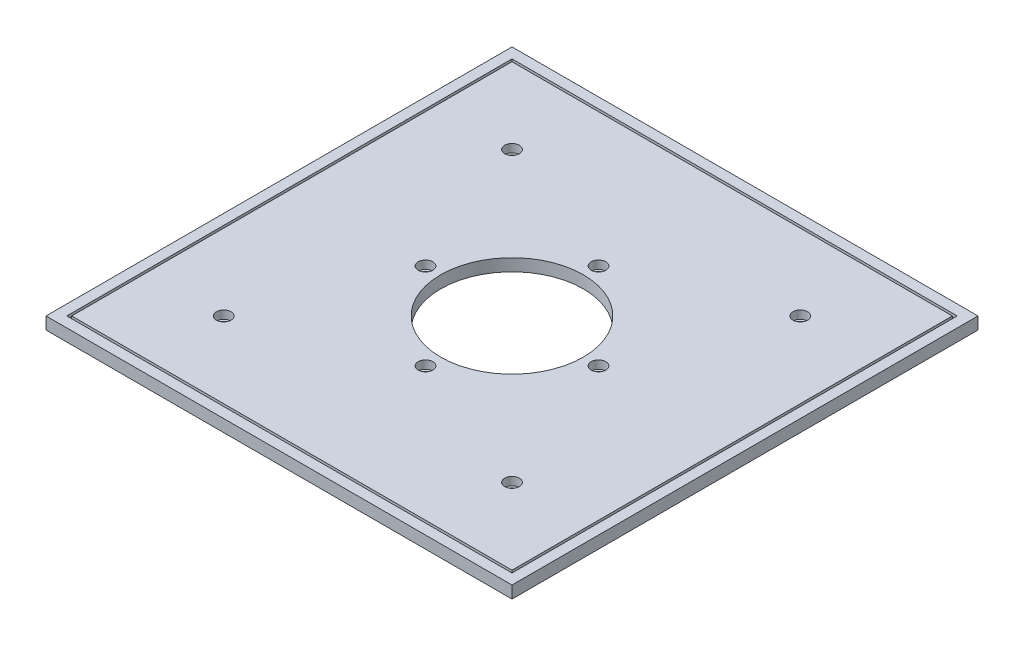
ISO-10303-21;
HEADER;
FILE_DESCRIPTION(('STEP AP214'),'2;1');
FILE_NAME('part.step','',(''),(''),'','','');
FILE_SCHEMA(('AUTOMOTIVE_DESIGN { 1 0 10303 214 1 1 1 1 }'));
ENDSEC;
DATA;
#1=APPLICATION_CONTEXT('core data for automotive mechanical design processes');
#2=APPLICATION_PROTOCOL_DEFINITION('international standard','automotive_design',2000,#1);
#3=PRODUCT_CONTEXT('',#1,'mechanical');
#4=PRODUCT('Part','Part','',(#3));
#5=PRODUCT_RELATED_PRODUCT_CATEGORY('part','',(#4));
#6=PRODUCT_DEFINITION_FORMATION('','',#4);
#7=PRODUCT_DEFINITION_CONTEXT('part definition',#1,'design');
#8=PRODUCT_DEFINITION('design','',#6,#7);
#9=PRODUCT_DEFINITION_SHAPE('','',#8);
#10=(LENGTH_UNIT() NAMED_UNIT(*) SI_UNIT(.MILLI.,.METRE.));
#11=(NAMED_UNIT(*) PLANE_ANGLE_UNIT() SI_UNIT($,.RADIAN.));
#12=(NAMED_UNIT(*) SI_UNIT($,.STERADIAN.) SOLID_ANGLE_UNIT());
#13=UNCERTAINTY_MEASURE_WITH_UNIT(LENGTH_MEASURE(1.E-05),#10,'distance_accuracy_value','');
#14=(GEOMETRIC_REPRESENTATION_CONTEXT(3) GLOBAL_UNCERTAINTY_ASSIGNED_CONTEXT((#13)) GLOBAL_UNIT_ASSIGNED_CONTEXT((#10,
#11,#12)) REPRESENTATION_CONTEXT('',''));
#15=CARTESIAN_POINT('',(0.,0.,0.));
#16=DIRECTION('',(0.,0.,1.));
#17=DIRECTION('',(1.,0.,0.));
#18=AXIS2_PLACEMENT_3D('',#15,#16,#17);
#19=CARTESIAN_POINT('',(0.,15.,0.));
#20=DIRECTION('',(0.,1.,0.));
#21=DIRECTION('',(0.,0.,1.));
#22=AXIS2_PLACEMENT_3D('',#19,#20,#21);
#23=PLANE('',#22);
#24=DIRECTION('',(1.,0.,0.));
#25=VECTOR('',#24,1.);
#26=CARTESIAN_POINT('',(-285.75,15.,285.75));
#27=LINE('',#26,#25);
#28=CARTESIAN_POINT('',(-285.75,15.,285.75));
#29=VERTEX_POINT('',#28);
#30=CARTESIAN_POINT('',(285.75,15.,285.75));
#31=VERTEX_POINT('',#30);
#32=EDGE_CURVE('E300',#29,#31,#27,.T.);
#33=ORIENTED_EDGE('',*,*,#32,.T.);
#34=DIRECTION('',(0.,0.,-1.));
#35=VECTOR('',#34,1.);
#36=CARTESIAN_POINT('',(285.75,15.,285.75));
#37=LINE('',#36,#35);
#38=CARTESIAN_POINT('',(285.75,15.,-285.75));
#39=VERTEX_POINT('',#38);
#40=EDGE_CURVE('E303',#31,#39,#37,.T.);
#41=ORIENTED_EDGE('',*,*,#40,.T.);
#42=DIRECTION('',(-1.,0.,0.));
#43=VECTOR('',#42,1.);
#44=CARTESIAN_POINT('',(-285.75,15.,-285.75));
#45=LINE('',#44,#43);
#46=CARTESIAN_POINT('',(-285.75,15.,-285.75));
#47=VERTEX_POINT('',#46);
#48=EDGE_CURVE('E306',#39,#47,#45,.T.);
#49=ORIENTED_EDGE('',*,*,#48,.T.);
#50=DIRECTION('',(0.,0.,1.));
#51=VECTOR('',#50,1.);
#52=CARTESIAN_POINT('',(-285.75,15.,285.75));
#53=LINE('',#52,#51);
#54=EDGE_CURVE('E308',#47,#29,#53,.T.);
#55=ORIENTED_EDGE('',*,*,#54,.T.);
#56=EDGE_LOOP('',(#33,#41,#49,#55));
#57=FACE_BOUND('',#56,.T.);
#58=DIRECTION('',(1.,0.,0.));
#59=VECTOR('',#58,1.);
#60=CARTESIAN_POINT('',(0.,15.,-273.));
#61=LINE('',#60,#59);
#62=CARTESIAN_POINT('',(-273.,15.,-273.));
#63=VERTEX_POINT('',#62);
#64=CARTESIAN_POINT('',(273.,15.,-273.));
#65=VERTEX_POINT('',#64);
#66=EDGE_CURVE('E169',#63,#65,#61,.T.);
#67=ORIENTED_EDGE('',*,*,#66,.T.);
#68=DIRECTION('',(0.,0.,1.));
#69=VECTOR('',#68,1.);
#70=CARTESIAN_POINT('',(273.,15.,0.));
#71=LINE('',#70,#69);
#72=CARTESIAN_POINT('',(273.,15.,273.));
#73=VERTEX_POINT('',#72);
#74=EDGE_CURVE('E54',#65,#73,#71,.T.);
#75=ORIENTED_EDGE('',*,*,#74,.T.);
#76=DIRECTION('',(1.,0.,0.));
#77=VECTOR('',#76,1.);
#78=CARTESIAN_POINT('',(0.,15.,273.));
#79=LINE('',#78,#77);
#80=CARTESIAN_POINT('',(-273.,15.,273.));
#81=VERTEX_POINT('',#80);
#82=EDGE_CURVE('E174',#81,#73,#79,.T.);
#83=ORIENTED_EDGE('',*,*,#82,.F.);
#84=DIRECTION('',(0.,0.,1.));
#85=VECTOR('',#84,1.);
#86=CARTESIAN_POINT('',(-273.,15.,0.));
#87=LINE('',#86,#85);
#88=EDGE_CURVE('E171',#63,#81,#87,.T.);
#89=ORIENTED_EDGE('',*,*,#88,.F.);
#90=EDGE_LOOP('',(#67,#75,#83,#89));
#91=FACE_BOUND('',#90,.T.);
#92=ADVANCED_FACE('F39',(#57,#91),#23,.T.);
#93=CARTESIAN_POINT('',(-285.75,15.,285.75));
#94=DIRECTION('',(0.,0.,-1.));
#95=DIRECTION('',(-1.,0.,0.));
#96=AXIS2_PLACEMENT_3D('',#93,#94,#95);
#97=PLANE('',#96);
#98=DIRECTION('',(1.,0.,0.));
#99=VECTOR('',#98,1.);
#100=CARTESIAN_POINT('',(-285.75,0.,285.75));
#101=LINE('',#100,#99);
#102=CARTESIAN_POINT('',(-285.75,0.,285.75));
#103=VERTEX_POINT('',#102);
#104=CARTESIAN_POINT('',(285.75,0.,285.75));
#105=VERTEX_POINT('',#104);
#106=EDGE_CURVE('E297',#103,#105,#101,.T.);
#107=ORIENTED_EDGE('',*,*,#106,.T.);
#108=DIRECTION('',(0.,-1.,0.));
#109=VECTOR('',#108,1.);
#110=CARTESIAN_POINT('',(285.75,15.,285.75));
#111=LINE('',#110,#109);
#112=EDGE_CURVE('E11',#31,#105,#111,.T.);
#113=ORIENTED_EDGE('',*,*,#112,.F.);
#114=ORIENTED_EDGE('',*,*,#32,.F.);
#115=DIRECTION('',(0.,-1.,0.));
#116=VECTOR('',#115,1.);
#117=CARTESIAN_POINT('',(-285.75,15.,285.75));
#118=LINE('',#117,#116);
#119=EDGE_CURVE('E310',#29,#103,#118,.T.);
#120=ORIENTED_EDGE('',*,*,#119,.T.);
#121=EDGE_LOOP('',(#107,#113,#114,#120));
#122=FACE_BOUND('',#121,.T.);
#123=ADVANCED_FACE('F41',(#122),#97,.F.);
#124=CARTESIAN_POINT('',(285.75,15.,285.75));
#125=DIRECTION('',(-1.,0.,0.));
#126=DIRECTION('',(0.,0.,1.));
#127=AXIS2_PLACEMENT_3D('',#124,#125,#126);
#128=PLANE('',#127);
#129=DIRECTION('',(0.,0.,-1.));
#130=VECTOR('',#129,1.);
#131=CARTESIAN_POINT('',(285.75,0.,285.75));
#132=LINE('',#131,#130);
#133=CARTESIAN_POINT('',(285.75,0.,-285.75));
#134=VERTEX_POINT('',#133);
#135=EDGE_CURVE('E313',#105,#134,#132,.T.);
#136=ORIENTED_EDGE('',*,*,#135,.T.);
#137=DIRECTION('',(0.,-1.,0.));
#138=VECTOR('',#137,1.);
#139=CARTESIAN_POINT('',(285.75,15.,-285.75));
#140=LINE('',#139,#138);
#141=EDGE_CURVE('E47',#39,#134,#140,.T.);
#142=ORIENTED_EDGE('',*,*,#141,.F.);
#143=ORIENTED_EDGE('',*,*,#40,.F.);
#144=ORIENTED_EDGE('',*,*,#112,.T.);
#145=EDGE_LOOP('',(#136,#142,#143,#144));
#146=FACE_BOUND('',#145,.T.);
#147=ADVANCED_FACE('F343',(#146),#128,.F.);
#148=CARTESIAN_POINT('',(-285.75,15.,-285.75));
#149=DIRECTION('',(0.,0.,1.));
#150=DIRECTION('',(1.,0.,0.));
#151=AXIS2_PLACEMENT_3D('',#148,#149,#150);
#152=PLANE('',#151);
#153=DIRECTION('',(-1.,0.,0.));
#154=VECTOR('',#153,1.);
#155=CARTESIAN_POINT('',(-285.75,0.,-285.75));
#156=LINE('',#155,#154);
#157=CARTESIAN_POINT('',(-285.75,0.,-285.75));
#158=VERTEX_POINT('',#157);
#159=EDGE_CURVE('E315',#134,#158,#156,.T.);
#160=ORIENTED_EDGE('',*,*,#159,.T.);
#161=DIRECTION('',(0.,-1.,0.));
#162=VECTOR('',#161,1.);
#163=CARTESIAN_POINT('',(-285.75,15.,-285.75));
#164=LINE('',#163,#162);
#165=EDGE_CURVE('E320',#47,#158,#164,.T.);
#166=ORIENTED_EDGE('',*,*,#165,.F.);
#167=ORIENTED_EDGE('',*,*,#48,.F.);
#168=ORIENTED_EDGE('',*,*,#141,.T.);
#169=EDGE_LOOP('',(#160,#166,#167,#168));
#170=FACE_BOUND('',#169,.T.);
#171=ADVANCED_FACE('F327',(#170),#152,.F.);
#172=CARTESIAN_POINT('',(-285.75,15.,285.75));
#173=DIRECTION('',(1.,0.,0.));
#174=DIRECTION('',(0.,0.,-1.));
#175=AXIS2_PLACEMENT_3D('',#172,#173,#174);
#176=PLANE('',#175);
#177=DIRECTION('',(0.,0.,1.));
#178=VECTOR('',#177,1.);
#179=CARTESIAN_POINT('',(-285.75,0.,285.75));
#180=LINE('',#179,#178);
#181=EDGE_CURVE('E304',#158,#103,#180,.T.);
#182=ORIENTED_EDGE('',*,*,#181,.T.);
#183=ORIENTED_EDGE('',*,*,#119,.F.);
#184=ORIENTED_EDGE('',*,*,#54,.F.);
#185=ORIENTED_EDGE('',*,*,#165,.T.);
#186=EDGE_LOOP('',(#182,#183,#184,#185));
#187=FACE_BOUND('',#186,.T.);
#188=ADVANCED_FACE('F336',(#187),#176,.F.);
#189=DIRECTION('',(1.,0.,0.));
#190=VECTOR('',#189,1.);
#191=CARTESIAN_POINT('',(0.,15.,-270.));
#192=LINE('',#191,#190);
#193=CARTESIAN_POINT('',(-270.,15.,-270.));
#194=VERTEX_POINT('',#193);
#195=CARTESIAN_POINT('',(270.,15.,-270.));
#196=VERTEX_POINT('',#195);
#197=EDGE_CURVE('E62',#194,#196,#192,.T.);
#198=ORIENTED_EDGE('',*,*,#197,.F.);
#199=DIRECTION('',(0.,0.,1.));
#200=VECTOR('',#199,1.);
#201=CARTESIAN_POINT('',(-270.,15.,0.));
#202=LINE('',#201,#200);
#203=CARTESIAN_POINT('',(-270.,15.,270.));
#204=VERTEX_POINT('',#203);
#205=EDGE_CURVE('E150',#194,#204,#202,.T.);
#206=ORIENTED_EDGE('',*,*,#205,.T.);
#207=DIRECTION('',(1.,0.,0.));
#208=VECTOR('',#207,1.);
#209=CARTESIAN_POINT('',(0.,15.,270.));
#210=LINE('',#209,#208);
#211=CARTESIAN_POINT('',(270.,15.,270.));
#212=VERTEX_POINT('',#211);
#213=EDGE_CURVE('E153',#204,#212,#210,.T.);
#214=ORIENTED_EDGE('',*,*,#213,.T.);
#215=DIRECTION('',(0.,0.,1.));
#216=VECTOR('',#215,1.);
#217=CARTESIAN_POINT('',(270.,15.,0.));
#218=LINE('',#217,#216);
#219=EDGE_CURVE('E178',#196,#212,#218,.T.);
#220=ORIENTED_EDGE('',*,*,#219,.F.);
#221=EDGE_LOOP('',(#198,#206,#214,#220));
#222=FACE_BOUND('',#221,.T.);
#223=CARTESIAN_POINT('',(-106.066017177982,15.,0.));
#224=DIRECTION('',(0.,1.,0.));
#225=DIRECTION('',(0.,0.,1.));
#226=AXIS2_PLACEMENT_3D('',#223,#224,#225);
#227=CIRCLE('',#226,9.00000000000001);
#228=CARTESIAN_POINT('',(-106.066017177982,15.,8.99999999999999));
#229=VERTEX_POINT('',#228);
#230=EDGE_CURVE('E185',#229,#229,#227,.T.);
#231=ORIENTED_EDGE('',*,*,#230,.F.);
#232=EDGE_LOOP('',(#231));
#233=FACE_BOUND('',#232,.T.);
#234=CARTESIAN_POINT('',(0.,15.,-106.066017177982));
#235=DIRECTION('',(0.,1.,0.));
#236=DIRECTION('',(0.,0.,1.));
#237=AXIS2_PLACEMENT_3D('',#234,#235,#236);
#238=CIRCLE('',#237,9.);
#239=CARTESIAN_POINT('',(0.,15.,-97.0660171779821));
#240=VERTEX_POINT('',#239);
#241=EDGE_CURVE('E209',#240,#240,#238,.T.);
#242=ORIENTED_EDGE('',*,*,#241,.F.);
#243=EDGE_LOOP('',(#242));
#244=FACE_BOUND('',#243,.T.);
#245=CARTESIAN_POINT('',(106.066017177982,15.,0.));
#246=DIRECTION('',(0.,1.,0.));
#247=DIRECTION('',(0.,0.,1.));
#248=AXIS2_PLACEMENT_3D('',#245,#246,#247);
#249=CIRCLE('',#248,9.00000000000001);
#250=CARTESIAN_POINT('',(106.066017177982,15.,9.00000000000004));
#251=VERTEX_POINT('',#250);
#252=EDGE_CURVE('E221',#251,#251,#249,.T.);
#253=ORIENTED_EDGE('',*,*,#252,.F.);
#254=EDGE_LOOP('',(#253));
#255=FACE_BOUND('',#254,.T.);
#256=CARTESIAN_POINT('',(0.,15.,106.066017177982));
#257=DIRECTION('',(0.,1.,0.));
#258=DIRECTION('',(0.,0.,1.));
#259=AXIS2_PLACEMENT_3D('',#256,#257,#258);
#260=CIRCLE('',#259,9.);
#261=CARTESIAN_POINT('',(0.,15.,115.066017177982));
#262=VERTEX_POINT('',#261);
#263=EDGE_CURVE('E233',#262,#262,#260,.T.);
#264=ORIENTED_EDGE('',*,*,#263,.F.);
#265=EDGE_LOOP('',(#264));
#266=FACE_BOUND('',#265,.T.);
#267=CARTESIAN_POINT('',(176.776695296637,15.,-176.776695296637));
#268=DIRECTION('',(0.,1.,0.));
#269=DIRECTION('',(0.,0.,1.));
#270=AXIS2_PLACEMENT_3D('',#267,#268,#269);
#271=CIRCLE('',#270,9.00000000000001);
#272=CARTESIAN_POINT('',(176.776695296637,15.,-167.776695296637));
#273=VERTEX_POINT('',#272);
#274=EDGE_CURVE('E245',#273,#273,#271,.T.);
#275=ORIENTED_EDGE('',*,*,#274,.F.);
#276=EDGE_LOOP('',(#275));
#277=FACE_BOUND('',#276,.T.);
#278=CARTESIAN_POINT('',(-176.776695296637,15.,-176.776695296637));
#279=DIRECTION('',(0.,1.,0.));
#280=DIRECTION('',(0.,0.,1.));
#281=AXIS2_PLACEMENT_3D('',#278,#279,#280);
#282=CIRCLE('',#281,9.00000000000001);
#283=CARTESIAN_POINT('',(-176.776695296637,15.,-167.776695296637));
#284=VERTEX_POINT('',#283);
#285=EDGE_CURVE('E257',#284,#284,#282,.T.);
#286=ORIENTED_EDGE('',*,*,#285,.F.);
#287=EDGE_LOOP('',(#286));
#288=FACE_BOUND('',#287,.T.);
#289=CARTESIAN_POINT('',(176.776695296637,15.,176.776695296637));
#290=DIRECTION('',(0.,1.,0.));
#291=DIRECTION('',(0.,0.,1.));
#292=AXIS2_PLACEMENT_3D('',#289,#290,#291);
#293=CIRCLE('',#292,9.00000000000001);
#294=CARTESIAN_POINT('',(176.776695296637,15.,185.776695296637));
#295=VERTEX_POINT('',#294);
#296=EDGE_CURVE('E269',#295,#295,#293,.T.);
#297=ORIENTED_EDGE('',*,*,#296,.F.);
#298=EDGE_LOOP('',(#297));
#299=FACE_BOUND('',#298,.T.);
#300=CARTESIAN_POINT('',(-176.776695296637,15.,176.776695296637));
#301=DIRECTION('',(0.,1.,0.));
#302=DIRECTION('',(0.,0.,1.));
#303=AXIS2_PLACEMENT_3D('',#300,#301,#302);
#304=CIRCLE('',#303,9.00000000000001);
#305=CARTESIAN_POINT('',(-176.776695296637,15.,185.776695296637));
#306=VERTEX_POINT('',#305);
#307=EDGE_CURVE('E281',#306,#306,#304,.T.);
#308=ORIENTED_EDGE('',*,*,#307,.F.);
#309=EDGE_LOOP('',(#308));
#310=FACE_BOUND('',#309,.T.);
#311=CARTESIAN_POINT('',(0.,15.,0.));
#312=DIRECTION('',(0.,1.,0.));
#313=DIRECTION('',(0.,0.,1.));
#314=AXIS2_PLACEMENT_3D('',#311,#312,#313);
#315=CIRCLE('',#314,87.5);
#316=CARTESIAN_POINT('',(0.,15.,87.5));
#317=VERTEX_POINT('',#316);
#318=EDGE_CURVE('E293',#317,#317,#315,.T.);
#319=ORIENTED_EDGE('',*,*,#318,.F.);
#320=EDGE_LOOP('',(#319));
#321=FACE_BOUND('',#320,.T.);
#322=ADVANCED_FACE('F352',(#222,#233,#244,#255,#266,#277,#288,#299,#310,#321),#23,.T.);
#323=CARTESIAN_POINT('',(0.,0.,0.));
#324=DIRECTION('',(0.,1.,0.));
#325=DIRECTION('',(0.,0.,1.));
#326=AXIS2_PLACEMENT_3D('',#323,#324,#325);
#327=PLANE('',#326);
#328=CARTESIAN_POINT('',(-106.066017177982,0.,0.));
#329=DIRECTION('',(0.,1.,0.));
#330=DIRECTION('',(0.,0.,1.));
#331=AXIS2_PLACEMENT_3D('',#328,#329,#330);
#332=CIRCLE('',#331,5.99999999999999);
#333=CARTESIAN_POINT('',(-106.066017177982,0.,5.99999999999998));
#334=VERTEX_POINT('',#333);
#335=EDGE_CURVE('E206',#334,#334,#332,.T.);
#336=ORIENTED_EDGE('',*,*,#335,.T.);
#337=EDGE_LOOP('',(#336));
#338=FACE_BOUND('',#337,.T.);
#339=CARTESIAN_POINT('',(0.,0.,-106.066017177982));
#340=DIRECTION('',(0.,1.,0.));
#341=DIRECTION('',(0.,0.,1.));
#342=AXIS2_PLACEMENT_3D('',#339,#340,#341);
#343=CIRCLE('',#342,6.);
#344=CARTESIAN_POINT('',(0.,0.,-100.066017177982));
#345=VERTEX_POINT('',#344);
#346=EDGE_CURVE('E218',#345,#345,#343,.T.);
#347=ORIENTED_EDGE('',*,*,#346,.T.);
#348=EDGE_LOOP('',(#347));
#349=FACE_BOUND('',#348,.T.);
#350=CARTESIAN_POINT('',(106.066017177982,0.,0.));
#351=DIRECTION('',(0.,1.,0.));
#352=DIRECTION('',(0.,0.,1.));
#353=AXIS2_PLACEMENT_3D('',#350,#351,#352);
#354=CIRCLE('',#353,5.99999999999999);
#355=CARTESIAN_POINT('',(106.066017177982,0.,6.00000000000002));
#356=VERTEX_POINT('',#355);
#357=EDGE_CURVE('E230',#356,#356,#354,.T.);
#358=ORIENTED_EDGE('',*,*,#357,.T.);
#359=EDGE_LOOP('',(#358));
#360=FACE_BOUND('',#359,.T.);
#361=CARTESIAN_POINT('',(0.,0.,106.066017177982));
#362=DIRECTION('',(0.,1.,0.));
#363=DIRECTION('',(0.,0.,1.));
#364=AXIS2_PLACEMENT_3D('',#361,#362,#363);
#365=CIRCLE('',#364,6.);
#366=CARTESIAN_POINT('',(0.,0.,112.066017177982));
#367=VERTEX_POINT('',#366);
#368=EDGE_CURVE('E242',#367,#367,#365,.T.);
#369=ORIENTED_EDGE('',*,*,#368,.T.);
#370=EDGE_LOOP('',(#369));
#371=FACE_BOUND('',#370,.T.);
#372=CARTESIAN_POINT('',(176.776695296637,0.,-176.776695296637));
#373=DIRECTION('',(0.,1.,0.));
#374=DIRECTION('',(0.,0.,1.));
#375=AXIS2_PLACEMENT_3D('',#372,#373,#374);
#376=CIRCLE('',#375,6.00000000000001);
#377=CARTESIAN_POINT('',(176.776695296637,0.,-170.776695296637));
#378=VERTEX_POINT('',#377);
#379=EDGE_CURVE('E254',#378,#378,#376,.T.);
#380=ORIENTED_EDGE('',*,*,#379,.T.);
#381=EDGE_LOOP('',(#380));
#382=FACE_BOUND('',#381,.T.);
#383=CARTESIAN_POINT('',(-176.776695296637,0.,-176.776695296637));
#384=DIRECTION('',(0.,1.,0.));
#385=DIRECTION('',(0.,0.,1.));
#386=AXIS2_PLACEMENT_3D('',#383,#384,#385);
#387=CIRCLE('',#386,6.00000000000001);
#388=CARTESIAN_POINT('',(-176.776695296637,0.,-170.776695296637));
#389=VERTEX_POINT('',#388);
#390=EDGE_CURVE('E266',#389,#389,#387,.T.);
#391=ORIENTED_EDGE('',*,*,#390,.T.);
#392=EDGE_LOOP('',(#391));
#393=FACE_BOUND('',#392,.T.);
#394=CARTESIAN_POINT('',(176.776695296637,0.,176.776695296637));
#395=DIRECTION('',(0.,1.,0.));
#396=DIRECTION('',(0.,0.,1.));
#397=AXIS2_PLACEMENT_3D('',#394,#395,#396);
#398=CIRCLE('',#397,6.00000000000001);
#399=CARTESIAN_POINT('',(176.776695296637,0.,182.776695296637));
#400=VERTEX_POINT('',#399);
#401=EDGE_CURVE('E278',#400,#400,#398,.T.);
#402=ORIENTED_EDGE('',*,*,#401,.T.);
#403=EDGE_LOOP('',(#402));
#404=FACE_BOUND('',#403,.T.);
#405=CARTESIAN_POINT('',(-176.776695296637,0.,176.776695296637));
#406=DIRECTION('',(0.,1.,0.));
#407=DIRECTION('',(0.,0.,1.));
#408=AXIS2_PLACEMENT_3D('',#405,#406,#407);
#409=CIRCLE('',#408,6.00000000000001);
#410=CARTESIAN_POINT('',(-176.776695296637,0.,182.776695296637));
#411=VERTEX_POINT('',#410);
#412=EDGE_CURVE('E290',#411,#411,#409,.T.);
#413=ORIENTED_EDGE('',*,*,#412,.T.);
#414=EDGE_LOOP('',(#413));
#415=FACE_BOUND('',#414,.T.);
#416=CARTESIAN_POINT('',(0.,0.,0.));
#417=DIRECTION('',(0.,1.,0.));
#418=DIRECTION('',(0.,0.,1.));
#419=AXIS2_PLACEMENT_3D('',#416,#417,#418);
#420=CIRCLE('',#419,87.5);
#421=CARTESIAN_POINT('',(0.,0.,87.5));
#422=VERTEX_POINT('',#421);
#423=EDGE_CURVE('E294',#422,#422,#420,.T.);
#424=ORIENTED_EDGE('',*,*,#423,.T.);
#425=EDGE_LOOP('',(#424));
#426=FACE_BOUND('',#425,.T.);
#427=ORIENTED_EDGE('',*,*,#106,.F.);
#428=ORIENTED_EDGE('',*,*,#181,.F.);
#429=ORIENTED_EDGE('',*,*,#159,.F.);
#430=ORIENTED_EDGE('',*,*,#135,.F.);
#431=EDGE_LOOP('',(#427,#428,#429,#430));
#432=FACE_BOUND('',#431,.T.);
#433=ADVANCED_FACE('F333',(#338,#349,#360,#371,#382,#393,#404,#415,#426,#432),#327,.F.);
#434=CARTESIAN_POINT('',(0.,0.,0.));
#435=DIRECTION('',(0.,1.,0.));
#436=DIRECTION('',(0.,0.,1.));
#437=AXIS2_PLACEMENT_3D('',#434,#435,#436);
#438=CYLINDRICAL_SURFACE('',#437,87.5);
#439=ORIENTED_EDGE('',*,*,#423,.F.);
#440=EDGE_LOOP('',(#439));
#441=FACE_BOUND('',#440,.T.);
#442=ORIENTED_EDGE('',*,*,#318,.T.);
#443=EDGE_LOOP('',(#442));
#444=FACE_BOUND('',#443,.T.);
#445=ADVANCED_FACE('F364',(#441,#444),#438,.F.);
#446=CARTESIAN_POINT('',(-176.776695296637,15.,176.776695296637));
#447=DIRECTION('',(0.,1.,0.));
#448=DIRECTION('',(0.,0.,1.));
#449=AXIS2_PLACEMENT_3D('',#446,#447,#448);
#450=CYLINDRICAL_SURFACE('',#449,6.00000000000001);
#451=ORIENTED_EDGE('',*,*,#412,.F.);
#452=EDGE_LOOP('',(#451));
#453=FACE_BOUND('',#452,.T.);
#454=CARTESIAN_POINT('',(-176.776695296637,5.,176.776695296637));
#455=DIRECTION('',(0.,1.,0.));
#456=DIRECTION('',(0.,0.,1.));
#457=AXIS2_PLACEMENT_3D('',#454,#455,#456);
#458=CIRCLE('',#457,6.00000000000001);
#459=CARTESIAN_POINT('',(-176.776695296637,5.,182.776695296637));
#460=VERTEX_POINT('',#459);
#461=EDGE_CURVE('E287',#460,#460,#458,.T.);
#462=ORIENTED_EDGE('',*,*,#461,.T.);
#463=EDGE_LOOP('',(#462));
#464=FACE_BOUND('',#463,.T.);
#465=ADVANCED_FACE('F389',(#453,#464),#450,.F.);
#466=CARTESIAN_POINT('',(-170.776695296637,5.,176.776695296637));
#467=DIRECTION('',(0.,-1.,0.));
#468=DIRECTION('',(0.,0.,-1.));
#469=AXIS2_PLACEMENT_3D('',#466,#467,#468);
#470=PLANE('',#469);
#471=ORIENTED_EDGE('',*,*,#461,.F.);
#472=EDGE_LOOP('',(#471));
#473=FACE_BOUND('',#472,.T.);
#474=CARTESIAN_POINT('',(-176.776695296637,5.,176.776695296637));
#475=DIRECTION('',(0.,1.,0.));
#476=DIRECTION('',(0.,0.,1.));
#477=AXIS2_PLACEMENT_3D('',#474,#475,#476);
#478=CIRCLE('',#477,9.00000000000001);
#479=CARTESIAN_POINT('',(-176.776695296637,5.,185.776695296637));
#480=VERTEX_POINT('',#479);
#481=EDGE_CURVE('E284',#480,#480,#478,.T.);
#482=ORIENTED_EDGE('',*,*,#481,.T.);
#483=EDGE_LOOP('',(#482));
#484=FACE_BOUND('',#483,.T.);
#485=ADVANCED_FACE('F394',(#473,#484),#470,.F.);
#486=CARTESIAN_POINT('',(-176.776695296637,15.,176.776695296637));
#487=DIRECTION('',(0.,1.,0.));
#488=DIRECTION('',(0.,0.,1.));
#489=AXIS2_PLACEMENT_3D('',#486,#487,#488);
#490=CYLINDRICAL_SURFACE('',#489,9.00000000000001);
#491=ORIENTED_EDGE('',*,*,#481,.F.);
#492=EDGE_LOOP('',(#491));
#493=FACE_BOUND('',#492,.T.);
#494=ORIENTED_EDGE('',*,*,#307,.T.);
#495=EDGE_LOOP('',(#494));
#496=FACE_BOUND('',#495,.T.);
#497=ADVANCED_FACE('F401',(#493,#496),#490,.F.);
#498=CARTESIAN_POINT('',(176.776695296637,15.,176.776695296637));
#499=DIRECTION('',(0.,1.,0.));
#500=DIRECTION('',(0.,0.,1.));
#501=AXIS2_PLACEMENT_3D('',#498,#499,#500);
#502=CYLINDRICAL_SURFACE('',#501,6.00000000000001);
#503=ORIENTED_EDGE('',*,*,#401,.F.);
#504=EDGE_LOOP('',(#503));
#505=FACE_BOUND('',#504,.T.);
#506=CARTESIAN_POINT('',(176.776695296637,5.,176.776695296637));
#507=DIRECTION('',(0.,1.,0.));
#508=DIRECTION('',(0.,0.,1.));
#509=AXIS2_PLACEMENT_3D('',#506,#507,#508);
#510=CIRCLE('',#509,6.00000000000001);
#511=CARTESIAN_POINT('',(176.776695296637,5.,182.776695296637));
#512=VERTEX_POINT('',#511);
#513=EDGE_CURVE('E275',#512,#512,#510,.T.);
#514=ORIENTED_EDGE('',*,*,#513,.T.);
#515=EDGE_LOOP('',(#514));
#516=FACE_BOUND('',#515,.T.);
#517=ADVANCED_FACE('F405',(#505,#516),#502,.F.);
#518=CARTESIAN_POINT('',(182.776695296637,5.,176.776695296637));
#519=DIRECTION('',(0.,-1.,0.));
#520=DIRECTION('',(0.,0.,-1.));
#521=AXIS2_PLACEMENT_3D('',#518,#519,#520);
#522=PLANE('',#521);
#523=ORIENTED_EDGE('',*,*,#513,.F.);
#524=EDGE_LOOP('',(#523));
#525=FACE_BOUND('',#524,.T.);
#526=CARTESIAN_POINT('',(176.776695296637,5.,176.776695296637));
#527=DIRECTION('',(0.,1.,0.));
#528=DIRECTION('',(0.,0.,1.));
#529=AXIS2_PLACEMENT_3D('',#526,#527,#528);
#530=CIRCLE('',#529,9.00000000000001);
#531=CARTESIAN_POINT('',(176.776695296637,5.,185.776695296637));
#532=VERTEX_POINT('',#531);
#533=EDGE_CURVE('E272',#532,#532,#530,.T.);
#534=ORIENTED_EDGE('',*,*,#533,.T.);
#535=EDGE_LOOP('',(#534));
#536=FACE_BOUND('',#535,.T.);
#537=ADVANCED_FACE('F409',(#525,#536),#522,.F.);
#538=CARTESIAN_POINT('',(176.776695296637,15.,176.776695296637));
#539=DIRECTION('',(0.,1.,0.));
#540=DIRECTION('',(0.,0.,1.));
#541=AXIS2_PLACEMENT_3D('',#538,#539,#540);
#542=CYLINDRICAL_SURFACE('',#541,9.00000000000001);
#543=ORIENTED_EDGE('',*,*,#533,.F.);
#544=EDGE_LOOP('',(#543));
#545=FACE_BOUND('',#544,.T.);
#546=ORIENTED_EDGE('',*,*,#296,.T.);
#547=EDGE_LOOP('',(#546));
#548=FACE_BOUND('',#547,.T.);
#549=ADVANCED_FACE('F413',(#545,#548),#542,.F.);
#550=CARTESIAN_POINT('',(-176.776695296637,15.,-176.776695296637));
#551=DIRECTION('',(0.,1.,0.));
#552=DIRECTION('',(0.,0.,1.));
#553=AXIS2_PLACEMENT_3D('',#550,#551,#552);
#554=CYLINDRICAL_SURFACE('',#553,6.00000000000001);
#555=ORIENTED_EDGE('',*,*,#390,.F.);
#556=EDGE_LOOP('',(#555));
#557=FACE_BOUND('',#556,.T.);
#558=CARTESIAN_POINT('',(-176.776695296637,5.,-176.776695296637));
#559=DIRECTION('',(0.,1.,0.));
#560=DIRECTION('',(0.,0.,1.));
#561=AXIS2_PLACEMENT_3D('',#558,#559,#560);
#562=CIRCLE('',#561,6.00000000000001);
#563=CARTESIAN_POINT('',(-176.776695296637,5.,-170.776695296637));
#564=VERTEX_POINT('',#563);
#565=EDGE_CURVE('E263',#564,#564,#562,.T.);
#566=ORIENTED_EDGE('',*,*,#565,.T.);
#567=EDGE_LOOP('',(#566));
#568=FACE_BOUND('',#567,.T.);
#569=ADVANCED_FACE('F417',(#557,#568),#554,.F.);
#570=CARTESIAN_POINT('',(-170.776695296637,5.,-176.776695296637));
#571=DIRECTION('',(0.,-1.,0.));
#572=DIRECTION('',(0.,0.,-1.));
#573=AXIS2_PLACEMENT_3D('',#570,#571,#572);
#574=PLANE('',#573);
#575=ORIENTED_EDGE('',*,*,#565,.F.);
#576=EDGE_LOOP('',(#575));
#577=FACE_BOUND('',#576,.T.);
#578=CARTESIAN_POINT('',(-176.776695296637,5.,-176.776695296637));
#579=DIRECTION('',(0.,1.,0.));
#580=DIRECTION('',(0.,0.,1.));
#581=AXIS2_PLACEMENT_3D('',#578,#579,#580);
#582=CIRCLE('',#581,9.00000000000001);
#583=CARTESIAN_POINT('',(-176.776695296637,5.,-167.776695296637));
#584=VERTEX_POINT('',#583);
#585=EDGE_CURVE('E260',#584,#584,#582,.T.);
#586=ORIENTED_EDGE('',*,*,#585,.T.);
#587=EDGE_LOOP('',(#586));
#588=FACE_BOUND('',#587,.T.);
#589=ADVANCED_FACE('F421',(#577,#588),#574,.F.);
#590=CARTESIAN_POINT('',(-176.776695296637,15.,-176.776695296637));
#591=DIRECTION('',(0.,1.,0.));
#592=DIRECTION('',(0.,0.,1.));
#593=AXIS2_PLACEMENT_3D('',#590,#591,#592);
#594=CYLINDRICAL_SURFACE('',#593,9.00000000000001);
#595=ORIENTED_EDGE('',*,*,#585,.F.);
#596=EDGE_LOOP('',(#595));
#597=FACE_BOUND('',#596,.T.);
#598=ORIENTED_EDGE('',*,*,#285,.T.);
#599=EDGE_LOOP('',(#598));
#600=FACE_BOUND('',#599,.T.);
#601=ADVANCED_FACE('F425',(#597,#600),#594,.F.);
#602=CARTESIAN_POINT('',(176.776695296637,15.,-176.776695296637));
#603=DIRECTION('',(0.,1.,0.));
#604=DIRECTION('',(0.,0.,1.));
#605=AXIS2_PLACEMENT_3D('',#602,#603,#604);
#606=CYLINDRICAL_SURFACE('',#605,6.00000000000001);
#607=ORIENTED_EDGE('',*,*,#379,.F.);
#608=EDGE_LOOP('',(#607));
#609=FACE_BOUND('',#608,.T.);
#610=CARTESIAN_POINT('',(176.776695296637,5.,-176.776695296637));
#611=DIRECTION('',(0.,1.,0.));
#612=DIRECTION('',(0.,0.,1.));
#613=AXIS2_PLACEMENT_3D('',#610,#611,#612);
#614=CIRCLE('',#613,6.00000000000001);
#615=CARTESIAN_POINT('',(176.776695296637,5.,-170.776695296637));
#616=VERTEX_POINT('',#615);
#617=EDGE_CURVE('E251',#616,#616,#614,.T.);
#618=ORIENTED_EDGE('',*,*,#617,.T.);
#619=EDGE_LOOP('',(#618));
#620=FACE_BOUND('',#619,.T.);
#621=ADVANCED_FACE('F429',(#609,#620),#606,.F.);
#622=CARTESIAN_POINT('',(182.776695296637,5.,-176.776695296637));
#623=DIRECTION('',(0.,-1.,0.));
#624=DIRECTION('',(0.,0.,-1.));
#625=AXIS2_PLACEMENT_3D('',#622,#623,#624);
#626=PLANE('',#625);
#627=ORIENTED_EDGE('',*,*,#617,.F.);
#628=EDGE_LOOP('',(#627));
#629=FACE_BOUND('',#628,.T.);
#630=CARTESIAN_POINT('',(176.776695296637,5.,-176.776695296637));
#631=DIRECTION('',(0.,1.,0.));
#632=DIRECTION('',(0.,0.,1.));
#633=AXIS2_PLACEMENT_3D('',#630,#631,#632);
#634=CIRCLE('',#633,9.00000000000001);
#635=CARTESIAN_POINT('',(176.776695296637,5.,-167.776695296637));
#636=VERTEX_POINT('',#635);
#637=EDGE_CURVE('E248',#636,#636,#634,.T.);
#638=ORIENTED_EDGE('',*,*,#637,.T.);
#639=EDGE_LOOP('',(#638));
#640=FACE_BOUND('',#639,.T.);
#641=ADVANCED_FACE('F433',(#629,#640),#626,.F.);
#642=CARTESIAN_POINT('',(176.776695296637,15.,-176.776695296637));
#643=DIRECTION('',(0.,1.,0.));
#644=DIRECTION('',(0.,0.,1.));
#645=AXIS2_PLACEMENT_3D('',#642,#643,#644);
#646=CYLINDRICAL_SURFACE('',#645,9.00000000000001);
#647=ORIENTED_EDGE('',*,*,#637,.F.);
#648=EDGE_LOOP('',(#647));
#649=FACE_BOUND('',#648,.T.);
#650=ORIENTED_EDGE('',*,*,#274,.T.);
#651=EDGE_LOOP('',(#650));
#652=FACE_BOUND('',#651,.T.);
#653=ADVANCED_FACE('F437',(#649,#652),#646,.F.);
#654=CARTESIAN_POINT('',(0.,15.,106.066017177982));
#655=DIRECTION('',(0.,1.,0.));
#656=DIRECTION('',(0.,0.,1.));
#657=AXIS2_PLACEMENT_3D('',#654,#655,#656);
#658=CYLINDRICAL_SURFACE('',#657,6.);
#659=ORIENTED_EDGE('',*,*,#368,.F.);
#660=EDGE_LOOP('',(#659));
#661=FACE_BOUND('',#660,.T.);
#662=CARTESIAN_POINT('',(0.,5.,106.066017177982));
#663=DIRECTION('',(0.,1.,0.));
#664=DIRECTION('',(0.,0.,1.));
#665=AXIS2_PLACEMENT_3D('',#662,#663,#664);
#666=CIRCLE('',#665,6.);
#667=CARTESIAN_POINT('',(0.,5.,112.066017177982));
#668=VERTEX_POINT('',#667);
#669=EDGE_CURVE('E239',#668,#668,#666,.T.);
#670=ORIENTED_EDGE('',*,*,#669,.T.);
#671=EDGE_LOOP('',(#670));
#672=FACE_BOUND('',#671,.T.);
#673=ADVANCED_FACE('F441',(#661,#672),#658,.F.);
#674=CARTESIAN_POINT('',(5.99999999999997,5.,106.066017177982));
#675=DIRECTION('',(0.,-1.,0.));
#676=DIRECTION('',(0.,0.,-1.));
#677=AXIS2_PLACEMENT_3D('',#674,#675,#676);
#678=PLANE('',#677);
#679=ORIENTED_EDGE('',*,*,#669,.F.);
#680=EDGE_LOOP('',(#679));
#681=FACE_BOUND('',#680,.T.);
#682=CARTESIAN_POINT('',(0.,5.,106.066017177982));
#683=DIRECTION('',(0.,1.,0.));
#684=DIRECTION('',(0.,0.,1.));
#685=AXIS2_PLACEMENT_3D('',#682,#683,#684);
#686=CIRCLE('',#685,9.);
#687=CARTESIAN_POINT('',(0.,5.,115.066017177982));
#688=VERTEX_POINT('',#687);
#689=EDGE_CURVE('E236',#688,#688,#686,.T.);
#690=ORIENTED_EDGE('',*,*,#689,.T.);
#691=EDGE_LOOP('',(#690));
#692=FACE_BOUND('',#691,.T.);
#693=ADVANCED_FACE('F445',(#681,#692),#678,.F.);
#694=CARTESIAN_POINT('',(0.,15.,106.066017177982));
#695=DIRECTION('',(0.,1.,0.));
#696=DIRECTION('',(0.,0.,1.));
#697=AXIS2_PLACEMENT_3D('',#694,#695,#696);
#698=CYLINDRICAL_SURFACE('',#697,9.);
#699=ORIENTED_EDGE('',*,*,#689,.F.);
#700=EDGE_LOOP('',(#699));
#701=FACE_BOUND('',#700,.T.);
#702=ORIENTED_EDGE('',*,*,#263,.T.);
#703=EDGE_LOOP('',(#702));
#704=FACE_BOUND('',#703,.T.);
#705=ADVANCED_FACE('F449',(#701,#704),#698,.F.);
#706=CARTESIAN_POINT('',(106.066017177982,15.,0.));
#707=DIRECTION('',(0.,1.,0.));
#708=DIRECTION('',(0.,0.,1.));
#709=AXIS2_PLACEMENT_3D('',#706,#707,#708);
#710=CYLINDRICAL_SURFACE('',#709,6.);
#711=ORIENTED_EDGE('',*,*,#357,.F.);
#712=EDGE_LOOP('',(#711));
#713=FACE_BOUND('',#712,.T.);
#714=CARTESIAN_POINT('',(106.066017177982,5.,0.));
#715=DIRECTION('',(0.,1.,0.));
#716=DIRECTION('',(0.,0.,1.));
#717=AXIS2_PLACEMENT_3D('',#714,#715,#716);
#718=CIRCLE('',#717,6.00000000000001);
#719=CARTESIAN_POINT('',(106.066017177982,5.,6.00000000000003));
#720=VERTEX_POINT('',#719);
#721=EDGE_CURVE('E227',#720,#720,#718,.T.);
#722=ORIENTED_EDGE('',*,*,#721,.T.);
#723=EDGE_LOOP('',(#722));
#724=FACE_BOUND('',#723,.T.);
#725=ADVANCED_FACE('F453',(#713,#724),#710,.F.);
#726=CARTESIAN_POINT('',(112.066017177982,5.,0.));
#727=DIRECTION('',(0.,-1.,0.));
#728=DIRECTION('',(0.,0.,-1.));
#729=AXIS2_PLACEMENT_3D('',#726,#727,#728);
#730=PLANE('',#729);
#731=ORIENTED_EDGE('',*,*,#721,.F.);
#732=EDGE_LOOP('',(#731));
#733=FACE_BOUND('',#732,.T.);
#734=CARTESIAN_POINT('',(106.066017177982,5.,0.));
#735=DIRECTION('',(0.,1.,0.));
#736=DIRECTION('',(0.,0.,1.));
#737=AXIS2_PLACEMENT_3D('',#734,#735,#736);
#738=CIRCLE('',#737,9.00000000000001);
#739=CARTESIAN_POINT('',(106.066017177982,5.,9.00000000000004));
#740=VERTEX_POINT('',#739);
#741=EDGE_CURVE('E224',#740,#740,#738,.T.);
#742=ORIENTED_EDGE('',*,*,#741,.T.);
#743=EDGE_LOOP('',(#742));
#744=FACE_BOUND('',#743,.T.);
#745=ADVANCED_FACE('F457',(#733,#744),#730,.F.);
#746=CARTESIAN_POINT('',(106.066017177982,15.,0.));
#747=DIRECTION('',(0.,1.,0.));
#748=DIRECTION('',(0.,0.,1.));
#749=AXIS2_PLACEMENT_3D('',#746,#747,#748);
#750=CYLINDRICAL_SURFACE('',#749,9.00000000000001);
#751=ORIENTED_EDGE('',*,*,#741,.F.);
#752=EDGE_LOOP('',(#751));
#753=FACE_BOUND('',#752,.T.);
#754=ORIENTED_EDGE('',*,*,#252,.T.);
#755=EDGE_LOOP('',(#754));
#756=FACE_BOUND('',#755,.T.);
#757=ADVANCED_FACE('F461',(#753,#756),#750,.F.);
#758=CARTESIAN_POINT('',(0.,15.,-106.066017177982));
#759=DIRECTION('',(0.,1.,0.));
#760=DIRECTION('',(0.,0.,1.));
#761=AXIS2_PLACEMENT_3D('',#758,#759,#760);
#762=CYLINDRICAL_SURFACE('',#761,6.);
#763=ORIENTED_EDGE('',*,*,#346,.F.);
#764=EDGE_LOOP('',(#763));
#765=FACE_BOUND('',#764,.T.);
#766=CARTESIAN_POINT('',(0.,5.,-106.066017177982));
#767=DIRECTION('',(0.,1.,0.));
#768=DIRECTION('',(0.,0.,1.));
#769=AXIS2_PLACEMENT_3D('',#766,#767,#768);
#770=CIRCLE('',#769,6.);
#771=CARTESIAN_POINT('',(0.,5.,-100.066017177982));
#772=VERTEX_POINT('',#771);
#773=EDGE_CURVE('E215',#772,#772,#770,.T.);
#774=ORIENTED_EDGE('',*,*,#773,.T.);
#775=EDGE_LOOP('',(#774));
#776=FACE_BOUND('',#775,.T.);
#777=ADVANCED_FACE('F465',(#765,#776),#762,.F.);
#778=CARTESIAN_POINT('',(6.00000000000001,5.,-106.066017177982));
#779=DIRECTION('',(0.,-1.,0.));
#780=DIRECTION('',(0.,0.,-1.));
#781=AXIS2_PLACEMENT_3D('',#778,#779,#780);
#782=PLANE('',#781);
#783=ORIENTED_EDGE('',*,*,#773,.F.);
#784=EDGE_LOOP('',(#783));
#785=FACE_BOUND('',#784,.T.);
#786=CARTESIAN_POINT('',(0.,5.,-106.066017177982));
#787=DIRECTION('',(0.,1.,0.));
#788=DIRECTION('',(0.,0.,1.));
#789=AXIS2_PLACEMENT_3D('',#786,#787,#788);
#790=CIRCLE('',#789,9.);
#791=CARTESIAN_POINT('',(0.,5.,-97.0660171779821));
#792=VERTEX_POINT('',#791);
#793=EDGE_CURVE('E212',#792,#792,#790,.T.);
#794=ORIENTED_EDGE('',*,*,#793,.T.);
#795=EDGE_LOOP('',(#794));
#796=FACE_BOUND('',#795,.T.);
#797=ADVANCED_FACE('F469',(#785,#796),#782,.F.);
#798=CARTESIAN_POINT('',(0.,15.,-106.066017177982));
#799=DIRECTION('',(0.,1.,0.));
#800=DIRECTION('',(0.,0.,1.));
#801=AXIS2_PLACEMENT_3D('',#798,#799,#800);
#802=CYLINDRICAL_SURFACE('',#801,9.);
#803=ORIENTED_EDGE('',*,*,#793,.F.);
#804=EDGE_LOOP('',(#803));
#805=FACE_BOUND('',#804,.T.);
#806=ORIENTED_EDGE('',*,*,#241,.T.);
#807=EDGE_LOOP('',(#806));
#808=FACE_BOUND('',#807,.T.);
#809=ADVANCED_FACE('F473',(#805,#808),#802,.F.);
#810=CARTESIAN_POINT('',(-106.066017177982,15.,0.));
#811=DIRECTION('',(0.,1.,0.));
#812=DIRECTION('',(0.,0.,1.));
#813=AXIS2_PLACEMENT_3D('',#810,#811,#812);
#814=CYLINDRICAL_SURFACE('',#813,6.);
#815=ORIENTED_EDGE('',*,*,#335,.F.);
#816=EDGE_LOOP('',(#815));
#817=FACE_BOUND('',#816,.T.);
#818=CARTESIAN_POINT('',(-106.066017177982,5.,0.));
#819=DIRECTION('',(0.,1.,0.));
#820=DIRECTION('',(0.,0.,1.));
#821=AXIS2_PLACEMENT_3D('',#818,#819,#820);
#822=CIRCLE('',#821,6.00000000000001);
#823=CARTESIAN_POINT('',(-106.066017177982,5.,5.99999999999999));
#824=VERTEX_POINT('',#823);
#825=EDGE_CURVE('E203',#824,#824,#822,.T.);
#826=ORIENTED_EDGE('',*,*,#825,.T.);
#827=EDGE_LOOP('',(#826));
#828=FACE_BOUND('',#827,.T.);
#829=ADVANCED_FACE('F477',(#817,#828),#814,.F.);
#830=CARTESIAN_POINT('',(-100.066017177982,5.,0.));
#831=DIRECTION('',(0.,-1.,0.));
#832=DIRECTION('',(0.,0.,-1.));
#833=AXIS2_PLACEMENT_3D('',#830,#831,#832);
#834=PLANE('',#833);
#835=ORIENTED_EDGE('',*,*,#825,.F.);
#836=EDGE_LOOP('',(#835));
#837=FACE_BOUND('',#836,.T.);
#838=CARTESIAN_POINT('',(-106.066017177982,5.,0.));
#839=DIRECTION('',(0.,1.,0.));
#840=DIRECTION('',(0.,0.,1.));
#841=AXIS2_PLACEMENT_3D('',#838,#839,#840);
#842=CIRCLE('',#841,9.00000000000001);
#843=CARTESIAN_POINT('',(-106.066017177982,5.,8.99999999999999));
#844=VERTEX_POINT('',#843);
#845=EDGE_CURVE('E200',#844,#844,#842,.T.);
#846=ORIENTED_EDGE('',*,*,#845,.T.);
#847=EDGE_LOOP('',(#846));
#848=FACE_BOUND('',#847,.T.);
#849=ADVANCED_FACE('F481',(#837,#848),#834,.F.);
#850=CARTESIAN_POINT('',(-106.066017177982,15.,0.));
#851=DIRECTION('',(0.,1.,0.));
#852=DIRECTION('',(0.,0.,1.));
#853=AXIS2_PLACEMENT_3D('',#850,#851,#852);
#854=CYLINDRICAL_SURFACE('',#853,9.00000000000001);
#855=ORIENTED_EDGE('',*,*,#845,.F.);
#856=EDGE_LOOP('',(#855));
#857=FACE_BOUND('',#856,.T.);
#858=ORIENTED_EDGE('',*,*,#230,.T.);
#859=EDGE_LOOP('',(#858));
#860=FACE_BOUND('',#859,.T.);
#861=ADVANCED_FACE('F485',(#857,#860),#854,.F.);
#862=CARTESIAN_POINT('',(0.,10.,-270.));
#863=DIRECTION('',(0.,0.,1.));
#864=DIRECTION('',(1.,0.,0.));
#865=AXIS2_PLACEMENT_3D('',#862,#863,#864);
#866=PLANE('',#865);
#867=ORIENTED_EDGE('',*,*,#197,.T.);
#868=DIRECTION('',(0.,1.,0.));
#869=VECTOR('',#868,1.);
#870=CARTESIAN_POINT('',(270.,10.,-270.));
#871=LINE('',#870,#869);
#872=CARTESIAN_POINT('',(270.,10.,-270.));
#873=VERTEX_POINT('',#872);
#874=EDGE_CURVE('E191',#873,#196,#871,.T.);
#875=ORIENTED_EDGE('',*,*,#874,.F.);
#876=DIRECTION('',(1.,0.,0.));
#877=VECTOR('',#876,1.);
#878=CARTESIAN_POINT('',(0.,10.,-270.));
#879=LINE('',#878,#877);
#880=CARTESIAN_POINT('',(-270.,10.,-270.));
#881=VERTEX_POINT('',#880);
#882=EDGE_CURVE('E158',#881,#873,#879,.T.);
#883=ORIENTED_EDGE('',*,*,#882,.F.);
#884=DIRECTION('',(0.,1.,0.));
#885=VECTOR('',#884,1.);
#886=CARTESIAN_POINT('',(-270.,10.,-270.));
#887=LINE('',#886,#885);
#888=EDGE_CURVE('E183',#881,#194,#887,.T.);
#889=ORIENTED_EDGE('',*,*,#888,.T.);
#890=EDGE_LOOP('',(#867,#875,#883,#889));
#891=FACE_BOUND('',#890,.T.);
#892=ADVANCED_FACE('F488',(#891),#866,.F.);
#893=CARTESIAN_POINT('',(-270.,10.,0.));
#894=DIRECTION('',(-1.,0.,0.));
#895=DIRECTION('',(0.,0.,1.));
#896=AXIS2_PLACEMENT_3D('',#893,#894,#895);
#897=PLANE('',#896);
#898=ORIENTED_EDGE('',*,*,#205,.F.);
#899=ORIENTED_EDGE('',*,*,#888,.F.);
#900=DIRECTION('',(0.,0.,1.));
#901=VECTOR('',#900,1.);
#902=CARTESIAN_POINT('',(-270.,10.,0.));
#903=LINE('',#902,#901);
#904=CARTESIAN_POINT('',(-270.,10.,270.));
#905=VERTEX_POINT('',#904);
#906=EDGE_CURVE('E143',#881,#905,#903,.T.);
#907=ORIENTED_EDGE('',*,*,#906,.T.);
#908=DIRECTION('',(0.,1.,0.));
#909=VECTOR('',#908,1.);
#910=CARTESIAN_POINT('',(-270.,10.,270.));
#911=LINE('',#910,#909);
#912=EDGE_CURVE('E186',#905,#204,#911,.T.);
#913=ORIENTED_EDGE('',*,*,#912,.T.);
#914=EDGE_LOOP('',(#898,#899,#907,#913));
#915=FACE_BOUND('',#914,.T.);
#916=ADVANCED_FACE('F505',(#915),#897,.T.);
#917=CARTESIAN_POINT('',(0.,10.,270.));
#918=DIRECTION('',(0.,0.,1.));
#919=DIRECTION('',(1.,0.,0.));
#920=AXIS2_PLACEMENT_3D('',#917,#918,#919);
#921=PLANE('',#920);
#922=ORIENTED_EDGE('',*,*,#213,.F.);
#923=ORIENTED_EDGE('',*,*,#912,.F.);
#924=DIRECTION('',(1.,0.,0.));
#925=VECTOR('',#924,1.);
#926=CARTESIAN_POINT('',(0.,10.,270.));
#927=LINE('',#926,#925);
#928=CARTESIAN_POINT('',(270.,10.,270.));
#929=VERTEX_POINT('',#928);
#930=EDGE_CURVE('E164',#905,#929,#927,.T.);
#931=ORIENTED_EDGE('',*,*,#930,.T.);
#932=DIRECTION('',(0.,1.,0.));
#933=VECTOR('',#932,1.);
#934=CARTESIAN_POINT('',(270.,10.,270.));
#935=LINE('',#934,#933);
#936=EDGE_CURVE('E189',#929,#212,#935,.T.);
#937=ORIENTED_EDGE('',*,*,#936,.T.);
#938=EDGE_LOOP('',(#922,#923,#931,#937));
#939=FACE_BOUND('',#938,.T.);
#940=ADVANCED_FACE('F493',(#939),#921,.T.);
#941=CARTESIAN_POINT('',(273.,10.,0.));
#942=DIRECTION('',(-1.,0.,0.));
#943=DIRECTION('',(0.,0.,1.));
#944=AXIS2_PLACEMENT_3D('',#941,#942,#943);
#945=PLANE('',#944);
#946=ORIENTED_EDGE('',*,*,#74,.F.);
#947=DIRECTION('',(0.,1.,0.));
#948=VECTOR('',#947,1.);
#949=CARTESIAN_POINT('',(273.,10.,-273.));
#950=LINE('',#949,#948);
#951=CARTESIAN_POINT('',(273.,10.,-273.));
#952=VERTEX_POINT('',#951);
#953=EDGE_CURVE('E131',#952,#65,#950,.T.);
#954=ORIENTED_EDGE('',*,*,#953,.F.);
#955=DIRECTION('',(0.,0.,1.));
#956=VECTOR('',#955,1.);
#957=CARTESIAN_POINT('',(273.,10.,0.));
#958=LINE('',#957,#956);
#959=CARTESIAN_POINT('',(273.,10.,273.));
#960=VERTEX_POINT('',#959);
#961=EDGE_CURVE('E139',#952,#960,#958,.T.);
#962=ORIENTED_EDGE('',*,*,#961,.T.);
#963=DIRECTION('',(0.,1.,0.));
#964=VECTOR('',#963,1.);
#965=CARTESIAN_POINT('',(273.,10.,273.));
#966=LINE('',#965,#964);
#967=EDGE_CURVE('E193',#960,#73,#966,.T.);
#968=ORIENTED_EDGE('',*,*,#967,.T.);
#969=EDGE_LOOP('',(#946,#954,#962,#968));
#970=FACE_BOUND('',#969,.T.);
#971=ADVANCED_FACE('F141',(#970),#945,.T.);
#972=CARTESIAN_POINT('',(0.,10.,273.));
#973=DIRECTION('',(0.,0.,1.));
#974=DIRECTION('',(1.,0.,0.));
#975=AXIS2_PLACEMENT_3D('',#972,#973,#974);
#976=PLANE('',#975);
#977=ORIENTED_EDGE('',*,*,#82,.T.);
#978=ORIENTED_EDGE('',*,*,#967,.F.);
#979=DIRECTION('',(1.,0.,0.));
#980=VECTOR('',#979,1.);
#981=CARTESIAN_POINT('',(0.,10.,273.));
#982=LINE('',#981,#980);
#983=CARTESIAN_POINT('',(-273.,10.,273.));
#984=VERTEX_POINT('',#983);
#985=EDGE_CURVE('E149',#984,#960,#982,.T.);
#986=ORIENTED_EDGE('',*,*,#985,.F.);
#987=DIRECTION('',(0.,1.,0.));
#988=VECTOR('',#987,1.);
#989=CARTESIAN_POINT('',(-273.,10.,273.));
#990=LINE('',#989,#988);
#991=EDGE_CURVE('E195',#984,#81,#990,.T.);
#992=ORIENTED_EDGE('',*,*,#991,.T.);
#993=EDGE_LOOP('',(#977,#978,#986,#992));
#994=FACE_BOUND('',#993,.T.);
#995=ADVANCED_FACE('F492',(#994),#976,.F.);
#996=CARTESIAN_POINT('',(-273.,10.,0.));
#997=DIRECTION('',(-1.,0.,0.));
#998=DIRECTION('',(0.,0.,1.));
#999=AXIS2_PLACEMENT_3D('',#996,#997,#998);
#1000=PLANE('',#999);
#1001=ORIENTED_EDGE('',*,*,#88,.T.);
#1002=ORIENTED_EDGE('',*,*,#991,.F.);
#1003=DIRECTION('',(0.,0.,1.));
#1004=VECTOR('',#1003,1.);
#1005=CARTESIAN_POINT('',(-273.,10.,0.));
#1006=LINE('',#1005,#1004);
#1007=CARTESIAN_POINT('',(-273.,10.,-273.));
#1008=VERTEX_POINT('',#1007);
#1009=EDGE_CURVE('E138',#1008,#984,#1006,.T.);
#1010=ORIENTED_EDGE('',*,*,#1009,.F.);
#1011=DIRECTION('',(0.,1.,0.));
#1012=VECTOR('',#1011,1.);
#1013=CARTESIAN_POINT('',(-273.,10.,-273.));
#1014=LINE('',#1013,#1012);
#1015=EDGE_CURVE('E133',#1008,#63,#1014,.T.);
#1016=ORIENTED_EDGE('',*,*,#1015,.T.);
#1017=EDGE_LOOP('',(#1001,#1002,#1010,#1016));
#1018=FACE_BOUND('',#1017,.T.);
#1019=ADVANCED_FACE('F497',(#1018),#1000,.F.);
#1020=CARTESIAN_POINT('',(0.,10.,-273.));
#1021=DIRECTION('',(0.,0.,1.));
#1022=DIRECTION('',(1.,0.,0.));
#1023=AXIS2_PLACEMENT_3D('',#1020,#1021,#1022);
#1024=PLANE('',#1023);
#1025=ORIENTED_EDGE('',*,*,#66,.F.);
#1026=ORIENTED_EDGE('',*,*,#1015,.F.);
#1027=DIRECTION('',(1.,0.,0.));
#1028=VECTOR('',#1027,1.);
#1029=CARTESIAN_POINT('',(0.,10.,-273.));
#1030=LINE('',#1029,#1028);
#1031=EDGE_CURVE('E128',#1008,#952,#1030,.T.);
#1032=ORIENTED_EDGE('',*,*,#1031,.T.);
#1033=ORIENTED_EDGE('',*,*,#953,.T.);
#1034=EDGE_LOOP('',(#1025,#1026,#1032,#1033));
#1035=FACE_BOUND('',#1034,.T.);
#1036=ADVANCED_FACE('F130',(#1035),#1024,.T.);
#1037=CARTESIAN_POINT('',(270.,10.,0.));
#1038=DIRECTION('',(-1.,0.,0.));
#1039=DIRECTION('',(0.,0.,1.));
#1040=AXIS2_PLACEMENT_3D('',#1037,#1038,#1039);
#1041=PLANE('',#1040);
#1042=ORIENTED_EDGE('',*,*,#219,.T.);
#1043=ORIENTED_EDGE('',*,*,#936,.F.);
#1044=DIRECTION('',(0.,0.,1.));
#1045=VECTOR('',#1044,1.);
#1046=CARTESIAN_POINT('',(270.,10.,0.));
#1047=LINE('',#1046,#1045);
#1048=EDGE_CURVE('E161',#873,#929,#1047,.T.);
#1049=ORIENTED_EDGE('',*,*,#1048,.F.);
#1050=ORIENTED_EDGE('',*,*,#874,.T.);
#1051=EDGE_LOOP('',(#1042,#1043,#1049,#1050));
#1052=FACE_BOUND('',#1051,.T.);
#1053=ADVANCED_FACE('F496',(#1052),#1041,.F.);
#1054=CARTESIAN_POINT('',(0.,10.,0.));
#1055=DIRECTION('',(0.,1.,0.));
#1056=DIRECTION('',(0.,0.,1.));
#1057=AXIS2_PLACEMENT_3D('',#1054,#1055,#1056);
#1058=PLANE('',#1057);
#1059=ORIENTED_EDGE('',*,*,#961,.F.);
#1060=ORIENTED_EDGE('',*,*,#1031,.F.);
#1061=ORIENTED_EDGE('',*,*,#1009,.T.);
#1062=ORIENTED_EDGE('',*,*,#985,.T.);
#1063=EDGE_LOOP('',(#1059,#1060,#1061,#1062));
#1064=FACE_BOUND('',#1063,.T.);
#1065=ORIENTED_EDGE('',*,*,#882,.T.);
#1066=ORIENTED_EDGE('',*,*,#1048,.T.);
#1067=ORIENTED_EDGE('',*,*,#930,.F.);
#1068=ORIENTED_EDGE('',*,*,#906,.F.);
#1069=EDGE_LOOP('',(#1065,#1066,#1067,#1068));
#1070=FACE_BOUND('',#1069,.T.);
#1071=ADVANCED_FACE('F146',(#1064,#1070),#1058,.T.);
#1072=CLOSED_SHELL('',(#92,#123,#147,#171,#188,#322,#433,#445,#465,#485,#497,#517,#537,#549,
#569,#589,#601,#621,#641,#653,#673,#693,#705,#725,#745,#757,#777,#797,#809,#829,#849,#861,#892,
#916,#940,#971,#995,#1019,#1036,#1053,#1071));
#1073=MANIFOLD_SOLID_BREP('B2',#1072);
#1074=ADVANCED_BREP_SHAPE_REPRESENTATION('',(#18,#1073),#14);
#1075=SHAPE_DEFINITION_REPRESENTATION(#9,#1074);
ENDSEC;
END-ISO-10303-21;
